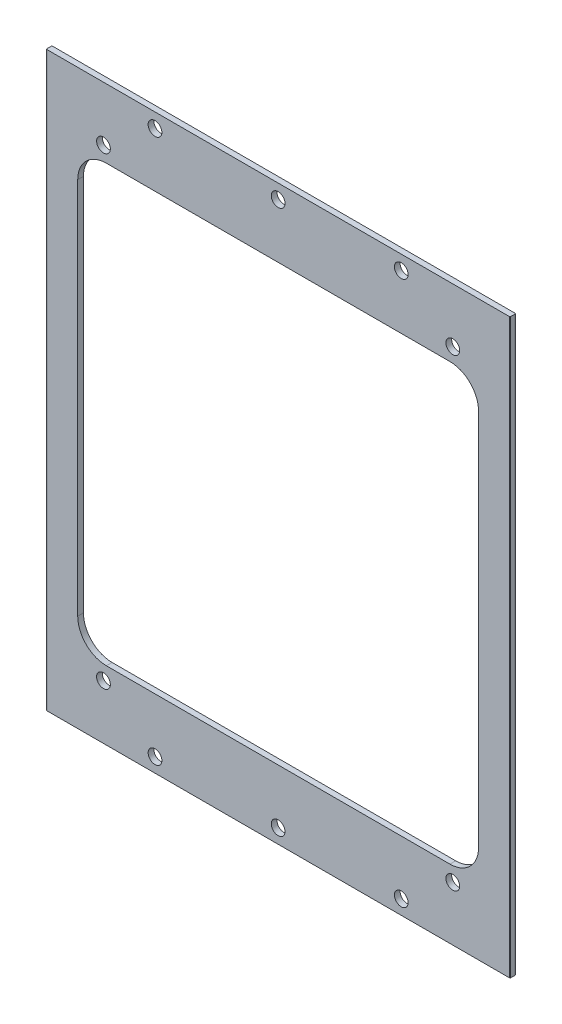
ISO-10303-21;
HEADER;
FILE_DESCRIPTION(('STEP AP214'),'2;1');
FILE_NAME('part.step','',(''),(''),'','','');
FILE_SCHEMA(('AUTOMOTIVE_DESIGN { 1 0 10303 214 1 1 1 1 }'));
ENDSEC;
DATA;
#1=APPLICATION_CONTEXT('core data for automotive mechanical design processes');
#2=APPLICATION_PROTOCOL_DEFINITION('international standard','automotive_design',2000,#1);
#3=PRODUCT_CONTEXT('',#1,'mechanical');
#4=PRODUCT('Part','Part','',(#3));
#5=PRODUCT_RELATED_PRODUCT_CATEGORY('part','',(#4));
#6=PRODUCT_DEFINITION_FORMATION('','',#4);
#7=PRODUCT_DEFINITION_CONTEXT('part definition',#1,'design');
#8=PRODUCT_DEFINITION('design','',#6,#7);
#9=PRODUCT_DEFINITION_SHAPE('','',#8);
#10=(LENGTH_UNIT() NAMED_UNIT(*) SI_UNIT(.MILLI.,.METRE.));
#11=(NAMED_UNIT(*) PLANE_ANGLE_UNIT() SI_UNIT($,.RADIAN.));
#12=(NAMED_UNIT(*) SI_UNIT($,.STERADIAN.) SOLID_ANGLE_UNIT());
#13=UNCERTAINTY_MEASURE_WITH_UNIT(LENGTH_MEASURE(1.E-05),#10,'distance_accuracy_value','');
#14=(GEOMETRIC_REPRESENTATION_CONTEXT(3) GLOBAL_UNCERTAINTY_ASSIGNED_CONTEXT((#13)) GLOBAL_UNIT_ASSIGNED_CONTEXT((#10,
#11,#12)) REPRESENTATION_CONTEXT('',''));
#15=CARTESIAN_POINT('',(0.,0.,0.));
#16=DIRECTION('',(0.,0.,1.));
#17=DIRECTION('',(1.,0.,0.));
#18=AXIS2_PLACEMENT_3D('',#15,#16,#17);
#19=CARTESIAN_POINT('',(40.5,-50.,0.5));
#20=DIRECTION('',(-1.,0.,0.));
#21=DIRECTION('',(0.,0.,1.));
#22=AXIS2_PLACEMENT_3D('',#19,#20,#21);
#23=PLANE('',#22);
#24=DIRECTION('',(0.,0.,-1.));
#25=VECTOR('',#24,1.);
#26=CARTESIAN_POINT('',(40.5,-50.,0.5));
#27=LINE('',#26,#25);
#28=CARTESIAN_POINT('',(40.5,-50.,0.4));
#29=VERTEX_POINT('',#28);
#30=CARTESIAN_POINT('',(40.5,-50.,-0.4));
#31=VERTEX_POINT('',#30);
#32=EDGE_CURVE('E233',#29,#31,#27,.T.);
#33=ORIENTED_EDGE('',*,*,#32,.T.);
#34=DIRECTION('',(0.,1.,0.));
#35=VECTOR('',#34,1.);
#36=CARTESIAN_POINT('',(40.5,50.,-0.4));
#37=LINE('',#36,#35);
#38=CARTESIAN_POINT('',(40.5,50.,-0.4));
#39=VERTEX_POINT('',#38);
#40=EDGE_CURVE('E281',#31,#39,#37,.T.);
#41=ORIENTED_EDGE('',*,*,#40,.T.);
#42=DIRECTION('',(0.,0.,-1.));
#43=VECTOR('',#42,1.);
#44=CARTESIAN_POINT('',(40.5,50.,0.5));
#45=LINE('',#44,#43);
#46=CARTESIAN_POINT('',(40.5,50.,0.4));
#47=VERTEX_POINT('',#46);
#48=EDGE_CURVE('E245',#47,#39,#45,.T.);
#49=ORIENTED_EDGE('',*,*,#48,.F.);
#50=DIRECTION('',(0.,1.,0.));
#51=VECTOR('',#50,1.);
#52=CARTESIAN_POINT('',(40.5,-50.,0.4));
#53=LINE('',#52,#51);
#54=EDGE_CURVE('E248',#47,#29,#53,.F.);
#55=ORIENTED_EDGE('',*,*,#54,.T.);
#56=EDGE_LOOP('',(#33,#41,#49,#55));
#57=FACE_BOUND('',#56,.T.);
#58=ADVANCED_FACE('F32',(#57),#23,.F.);
#59=CARTESIAN_POINT('',(-40.5,50.,0.5));
#60=DIRECTION('',(0.,-1.,0.));
#61=DIRECTION('',(0.,0.,-1.));
#62=AXIS2_PLACEMENT_3D('',#59,#60,#61);
#63=PLANE('',#62);
#64=ORIENTED_EDGE('',*,*,#48,.T.);
#65=CARTESIAN_POINT('',(40.4,50.,-0.4));
#66=DIRECTION('',(0.,-1.,0.));
#67=DIRECTION('',(0.,0.,-1.));
#68=AXIS2_PLACEMENT_3D('',#65,#66,#67);
#69=CIRCLE('',#68,0.1);
#70=CARTESIAN_POINT('',(40.4,50.,-0.5));
#71=VERTEX_POINT('',#70);
#72=EDGE_CURVE('E290',#39,#71,#69,.F.);
#73=ORIENTED_EDGE('',*,*,#72,.T.);
#74=DIRECTION('',(-1.,0.,0.));
#75=VECTOR('',#74,1.);
#76=CARTESIAN_POINT('',(-40.5,50.,-0.5));
#77=LINE('',#76,#75);
#78=CARTESIAN_POINT('',(-40.4,50.,-0.5));
#79=VERTEX_POINT('',#78);
#80=EDGE_CURVE('E214',#71,#79,#77,.T.);
#81=ORIENTED_EDGE('',*,*,#80,.T.);
#82=CARTESIAN_POINT('',(-40.4,50.,-0.4));
#83=DIRECTION('',(0.,-1.,0.));
#84=DIRECTION('',(0.,0.,-1.));
#85=AXIS2_PLACEMENT_3D('',#82,#83,#84);
#86=CIRCLE('',#85,0.1);
#87=CARTESIAN_POINT('',(-40.5,50.,-0.4));
#88=VERTEX_POINT('',#87);
#89=EDGE_CURVE('E286',#79,#88,#86,.F.);
#90=ORIENTED_EDGE('',*,*,#89,.T.);
#91=DIRECTION('',(0.,0.,-1.));
#92=VECTOR('',#91,1.);
#93=CARTESIAN_POINT('',(-40.5,50.,0.5));
#94=LINE('',#93,#92);
#95=CARTESIAN_POINT('',(-40.5,50.,0.4));
#96=VERTEX_POINT('',#95);
#97=EDGE_CURVE('E242',#96,#88,#94,.T.);
#98=ORIENTED_EDGE('',*,*,#97,.F.);
#99=CARTESIAN_POINT('',(-40.4,50.,0.4));
#100=DIRECTION('',(0.,-1.,0.));
#101=DIRECTION('',(0.,0.,-1.));
#102=AXIS2_PLACEMENT_3D('',#99,#100,#101);
#103=CIRCLE('',#102,0.1);
#104=CARTESIAN_POINT('',(-40.4,50.,0.5));
#105=VERTEX_POINT('',#104);
#106=EDGE_CURVE('E284',#96,#105,#103,.F.);
#107=ORIENTED_EDGE('',*,*,#106,.T.);
#108=DIRECTION('',(-1.,0.,0.));
#109=VECTOR('',#108,1.);
#110=CARTESIAN_POINT('',(-40.5,50.,0.5));
#111=LINE('',#110,#109);
#112=CARTESIAN_POINT('',(40.4,50.,0.5));
#113=VERTEX_POINT('',#112);
#114=EDGE_CURVE('E226',#113,#105,#111,.T.);
#115=ORIENTED_EDGE('',*,*,#114,.F.);
#116=CARTESIAN_POINT('',(40.4,50.,0.4));
#117=DIRECTION('',(0.,-1.,0.));
#118=DIRECTION('',(0.,0.,-1.));
#119=AXIS2_PLACEMENT_3D('',#116,#117,#118);
#120=CIRCLE('',#119,0.1);
#121=EDGE_CURVE('E288',#113,#47,#120,.F.);
#122=ORIENTED_EDGE('',*,*,#121,.T.);
#123=EDGE_LOOP('',(#64,#73,#81,#90,#98,#107,#115,#122));
#124=FACE_BOUND('',#123,.T.);
#125=ADVANCED_FACE('F314',(#124),#63,.F.);
#126=CARTESIAN_POINT('',(-40.5,-50.,0.5));
#127=DIRECTION('',(1.,0.,0.));
#128=DIRECTION('',(0.,0.,-1.));
#129=AXIS2_PLACEMENT_3D('',#126,#127,#128);
#130=PLANE('',#129);
#131=ORIENTED_EDGE('',*,*,#97,.T.);
#132=DIRECTION('',(0.,-1.,0.));
#133=VECTOR('',#132,1.);
#134=CARTESIAN_POINT('',(-40.5,-50.,-0.4));
#135=LINE('',#134,#133);
#136=CARTESIAN_POINT('',(-40.5,-50.,-0.4));
#137=VERTEX_POINT('',#136);
#138=EDGE_CURVE('E11',#88,#137,#135,.T.);
#139=ORIENTED_EDGE('',*,*,#138,.T.);
#140=DIRECTION('',(0.,0.,-1.));
#141=VECTOR('',#140,1.);
#142=CARTESIAN_POINT('',(-40.5,-50.,0.5));
#143=LINE('',#142,#141);
#144=CARTESIAN_POINT('',(-40.5,-50.,0.4));
#145=VERTEX_POINT('',#144);
#146=EDGE_CURVE('E240',#145,#137,#143,.T.);
#147=ORIENTED_EDGE('',*,*,#146,.F.);
#148=DIRECTION('',(0.,-1.,0.));
#149=VECTOR('',#148,1.);
#150=CARTESIAN_POINT('',(-40.5,-50.,0.4));
#151=LINE('',#150,#149);
#152=EDGE_CURVE('E40',#145,#96,#151,.F.);
#153=ORIENTED_EDGE('',*,*,#152,.T.);
#154=EDGE_LOOP('',(#131,#139,#147,#153));
#155=FACE_BOUND('',#154,.T.);
#156=ADVANCED_FACE('F310',(#155),#130,.F.);
#157=CARTESIAN_POINT('',(-40.5,-50.,0.5));
#158=DIRECTION('',(0.,1.,0.));
#159=DIRECTION('',(0.,0.,1.));
#160=AXIS2_PLACEMENT_3D('',#157,#158,#159);
#161=PLANE('',#160);
#162=DIRECTION('',(1.,0.,0.));
#163=VECTOR('',#162,1.);
#164=CARTESIAN_POINT('',(-40.5,-50.,-0.5));
#165=LINE('',#164,#163);
#166=CARTESIAN_POINT('',(-40.4,-50.,-0.5));
#167=VERTEX_POINT('',#166);
#168=CARTESIAN_POINT('',(40.4,-50.,-0.5));
#169=VERTEX_POINT('',#168);
#170=EDGE_CURVE('E230',#167,#169,#165,.T.);
#171=ORIENTED_EDGE('',*,*,#170,.T.);
#172=CARTESIAN_POINT('',(40.4,-50.,-0.4));
#173=DIRECTION('',(0.,1.,0.));
#174=DIRECTION('',(0.,0.,1.));
#175=AXIS2_PLACEMENT_3D('',#172,#173,#174);
#176=CIRCLE('',#175,0.1);
#177=EDGE_CURVE('E300',#169,#31,#176,.F.);
#178=ORIENTED_EDGE('',*,*,#177,.T.);
#179=ORIENTED_EDGE('',*,*,#32,.F.);
#180=CARTESIAN_POINT('',(40.4,-50.,0.4));
#181=DIRECTION('',(0.,1.,0.));
#182=DIRECTION('',(0.,0.,1.));
#183=AXIS2_PLACEMENT_3D('',#180,#181,#182);
#184=CIRCLE('',#183,0.1);
#185=CARTESIAN_POINT('',(40.4,-50.,0.5));
#186=VERTEX_POINT('',#185);
#187=EDGE_CURVE('E298',#29,#186,#184,.F.);
#188=ORIENTED_EDGE('',*,*,#187,.T.);
#189=DIRECTION('',(1.,0.,0.));
#190=VECTOR('',#189,1.);
#191=CARTESIAN_POINT('',(-40.5,-50.,0.5));
#192=LINE('',#191,#190);
#193=CARTESIAN_POINT('',(-40.4,-50.,0.5));
#194=VERTEX_POINT('',#193);
#195=EDGE_CURVE('E229',#194,#186,#192,.T.);
#196=ORIENTED_EDGE('',*,*,#195,.F.);
#197=CARTESIAN_POINT('',(-40.4,-50.,0.4));
#198=DIRECTION('',(0.,1.,0.));
#199=DIRECTION('',(0.,0.,1.));
#200=AXIS2_PLACEMENT_3D('',#197,#198,#199);
#201=CIRCLE('',#200,0.1);
#202=EDGE_CURVE('E54',#194,#145,#201,.F.);
#203=ORIENTED_EDGE('',*,*,#202,.T.);
#204=ORIENTED_EDGE('',*,*,#146,.T.);
#205=CARTESIAN_POINT('',(-40.4,-50.,-0.4));
#206=DIRECTION('',(0.,1.,0.));
#207=DIRECTION('',(0.,0.,1.));
#208=AXIS2_PLACEMENT_3D('',#205,#206,#207);
#209=CIRCLE('',#208,0.1);
#210=EDGE_CURVE('E47',#137,#167,#209,.F.);
#211=ORIENTED_EDGE('',*,*,#210,.T.);
#212=EDGE_LOOP('',(#171,#178,#179,#188,#196,#203,#204,#211));
#213=FACE_BOUND('',#212,.T.);
#214=ADVANCED_FACE('F321',(#213),#161,.F.);
#215=CARTESIAN_POINT('',(0.,0.,0.5));
#216=DIRECTION('',(0.,0.,-1.));
#217=DIRECTION('',(-1.,0.,0.));
#218=AXIS2_PLACEMENT_3D('',#215,#216,#217);
#219=PLANE('',#218);
#220=CARTESIAN_POINT('',(0.,47.5,0.5));
#221=DIRECTION('',(0.,0.,1.));
#222=DIRECTION('',(1.,0.,0.));
#223=AXIS2_PLACEMENT_3D('',#220,#221,#222);
#224=CIRCLE('',#223,1.19999999999998);
#225=CARTESIAN_POINT('',(1.19999999999998,47.5,0.5));
#226=VERTEX_POINT('',#225);
#227=EDGE_CURVE('E279',#226,#226,#224,.T.);
#228=ORIENTED_EDGE('',*,*,#227,.F.);
#229=EDGE_LOOP('',(#228));
#230=FACE_BOUND('',#229,.T.);
#231=CARTESIAN_POINT('',(0.,-47.5,0.5));
#232=DIRECTION('',(0.,0.,1.));
#233=DIRECTION('',(1.,0.,0.));
#234=AXIS2_PLACEMENT_3D('',#231,#232,#233);
#235=CIRCLE('',#234,1.19999999999998);
#236=CARTESIAN_POINT('',(1.19999999999998,-47.5,0.5));
#237=VERTEX_POINT('',#236);
#238=EDGE_CURVE('E275',#237,#237,#235,.T.);
#239=ORIENTED_EDGE('',*,*,#238,.F.);
#240=EDGE_LOOP('',(#239));
#241=FACE_BOUND('',#240,.T.);
#242=CARTESIAN_POINT('',(-21.5,47.5,0.5));
#243=DIRECTION('',(0.,0.,1.));
#244=DIRECTION('',(1.,0.,0.));
#245=AXIS2_PLACEMENT_3D('',#242,#243,#244);
#246=CIRCLE('',#245,1.19999999999999);
#247=CARTESIAN_POINT('',(-20.3,47.5,0.5));
#248=VERTEX_POINT('',#247);
#249=EDGE_CURVE('E271',#248,#248,#246,.T.);
#250=ORIENTED_EDGE('',*,*,#249,.F.);
#251=EDGE_LOOP('',(#250));
#252=FACE_BOUND('',#251,.T.);
#253=CARTESIAN_POINT('',(21.5,47.5,0.5));
#254=DIRECTION('',(0.,0.,1.));
#255=DIRECTION('',(1.,0.,0.));
#256=AXIS2_PLACEMENT_3D('',#253,#254,#255);
#257=CIRCLE('',#256,1.19999999999999);
#258=CARTESIAN_POINT('',(22.7,47.5,0.5));
#259=VERTEX_POINT('',#258);
#260=EDGE_CURVE('E267',#259,#259,#257,.T.);
#261=ORIENTED_EDGE('',*,*,#260,.F.);
#262=EDGE_LOOP('',(#261));
#263=FACE_BOUND('',#262,.T.);
#264=CARTESIAN_POINT('',(-21.5,-47.5,0.5));
#265=DIRECTION('',(0.,0.,1.));
#266=DIRECTION('',(1.,0.,0.));
#267=AXIS2_PLACEMENT_3D('',#264,#265,#266);
#268=CIRCLE('',#267,1.19999999999999);
#269=CARTESIAN_POINT('',(-20.3,-47.5,0.5));
#270=VERTEX_POINT('',#269);
#271=EDGE_CURVE('E266',#270,#270,#268,.T.);
#272=ORIENTED_EDGE('',*,*,#271,.F.);
#273=EDGE_LOOP('',(#272));
#274=FACE_BOUND('',#273,.T.);
#275=CARTESIAN_POINT('',(21.5,-47.5,0.5));
#276=DIRECTION('',(0.,0.,1.));
#277=DIRECTION('',(1.,0.,0.));
#278=AXIS2_PLACEMENT_3D('',#275,#276,#277);
#279=CIRCLE('',#278,1.19999999999999);
#280=CARTESIAN_POINT('',(22.7,-47.5,0.5));
#281=VERTEX_POINT('',#280);
#282=EDGE_CURVE('E642',#281,#281,#279,.T.);
#283=ORIENTED_EDGE('',*,*,#282,.F.);
#284=EDGE_LOOP('',(#283));
#285=FACE_BOUND('',#284,.T.);
#286=CARTESIAN_POINT('',(-30.5,40.5,0.5));
#287=DIRECTION('',(0.,0.,1.));
#288=DIRECTION('',(1.,0.,0.));
#289=AXIS2_PLACEMENT_3D('',#286,#287,#288);
#290=CIRCLE('',#289,1.19999999999999);
#291=CARTESIAN_POINT('',(-29.3,40.5,0.5));
#292=VERTEX_POINT('',#291);
#293=EDGE_CURVE('E262',#292,#292,#290,.T.);
#294=ORIENTED_EDGE('',*,*,#293,.F.);
#295=EDGE_LOOP('',(#294));
#296=FACE_BOUND('',#295,.T.);
#297=CARTESIAN_POINT('',(30.5,40.5,0.5));
#298=DIRECTION('',(0.,0.,1.));
#299=DIRECTION('',(1.,0.,0.));
#300=AXIS2_PLACEMENT_3D('',#297,#298,#299);
#301=CIRCLE('',#300,1.19999999999999);
#302=CARTESIAN_POINT('',(31.7,40.5,0.5));
#303=VERTEX_POINT('',#302);
#304=EDGE_CURVE('E258',#303,#303,#301,.T.);
#305=ORIENTED_EDGE('',*,*,#304,.F.);
#306=EDGE_LOOP('',(#305));
#307=FACE_BOUND('',#306,.T.);
#308=CARTESIAN_POINT('',(-30.5,-40.5,0.5));
#309=DIRECTION('',(0.,0.,1.));
#310=DIRECTION('',(1.,0.,0.));
#311=AXIS2_PLACEMENT_3D('',#308,#309,#310);
#312=CIRCLE('',#311,1.19999999999999);
#313=CARTESIAN_POINT('',(-29.3,-40.5,0.5));
#314=VERTEX_POINT('',#313);
#315=EDGE_CURVE('E254',#314,#314,#312,.T.);
#316=ORIENTED_EDGE('',*,*,#315,.F.);
#317=EDGE_LOOP('',(#316));
#318=FACE_BOUND('',#317,.T.);
#319=CARTESIAN_POINT('',(30.5,-40.5,0.5));
#320=DIRECTION('',(0.,0.,1.));
#321=DIRECTION('',(1.,0.,0.));
#322=AXIS2_PLACEMENT_3D('',#319,#320,#321);
#323=CIRCLE('',#322,1.19999999999999);
#324=CARTESIAN_POINT('',(31.7,-40.5,0.5));
#325=VERTEX_POINT('',#324);
#326=EDGE_CURVE('E178',#325,#325,#323,.T.);
#327=ORIENTED_EDGE('',*,*,#326,.F.);
#328=EDGE_LOOP('',(#327));
#329=FACE_BOUND('',#328,.T.);
#330=DIRECTION('',(0.,-1.,0.));
#331=VECTOR('',#330,1.);
#332=CARTESIAN_POINT('',(-35.,-33.,0.5));
#333=LINE('',#332,#331);
#334=CARTESIAN_POINT('',(-35.,33.,0.5));
#335=VERTEX_POINT('',#334);
#336=CARTESIAN_POINT('',(-35.,-33.,0.5));
#337=VERTEX_POINT('',#336);
#338=EDGE_CURVE('E195',#335,#337,#333,.T.);
#339=ORIENTED_EDGE('',*,*,#338,.F.);
#340=CARTESIAN_POINT('',(-30.,33.,0.5));
#341=DIRECTION('',(0.,0.,1.));
#342=DIRECTION('',(-1.,0.,0.));
#343=AXIS2_PLACEMENT_3D('',#340,#341,#342);
#344=CIRCLE('',#343,4.99999999999999);
#345=CARTESIAN_POINT('',(-30.,38.,0.5));
#346=VERTEX_POINT('',#345);
#347=EDGE_CURVE('E153',#346,#335,#344,.T.);
#348=ORIENTED_EDGE('',*,*,#347,.F.);
#349=DIRECTION('',(-1.,0.,0.));
#350=VECTOR('',#349,1.);
#351=CARTESIAN_POINT('',(-30.,38.,0.5));
#352=LINE('',#351,#350);
#353=CARTESIAN_POINT('',(30.,38.,0.5));
#354=VERTEX_POINT('',#353);
#355=EDGE_CURVE('E172',#354,#346,#352,.T.);
#356=ORIENTED_EDGE('',*,*,#355,.F.);
#357=CARTESIAN_POINT('',(30.,33.,0.5));
#358=DIRECTION('',(0.,0.,1.));
#359=DIRECTION('',(-1.,0.,0.));
#360=AXIS2_PLACEMENT_3D('',#357,#358,#359);
#361=CIRCLE('',#360,5.);
#362=CARTESIAN_POINT('',(35.,33.,0.5));
#363=VERTEX_POINT('',#362);
#364=EDGE_CURVE('E175',#363,#354,#361,.T.);
#365=ORIENTED_EDGE('',*,*,#364,.F.);
#366=DIRECTION('',(0.,1.,0.));
#367=VECTOR('',#366,1.);
#368=CARTESIAN_POINT('',(35.,-33.,0.5));
#369=LINE('',#368,#367);
#370=CARTESIAN_POINT('',(35.,-33.,0.5));
#371=VERTEX_POINT('',#370);
#372=EDGE_CURVE('E207',#371,#363,#369,.T.);
#373=ORIENTED_EDGE('',*,*,#372,.F.);
#374=CARTESIAN_POINT('',(30.,-33.,0.5));
#375=DIRECTION('',(0.,0.,1.));
#376=DIRECTION('',(-1.,0.,0.));
#377=AXIS2_PLACEMENT_3D('',#374,#375,#376);
#378=CIRCLE('',#377,5.);
#379=CARTESIAN_POINT('',(30.,-38.,0.5));
#380=VERTEX_POINT('',#379);
#381=EDGE_CURVE('E204',#380,#371,#378,.T.);
#382=ORIENTED_EDGE('',*,*,#381,.F.);
#383=DIRECTION('',(1.,0.,0.));
#384=VECTOR('',#383,1.);
#385=CARTESIAN_POINT('',(-30.,-38.,0.5));
#386=LINE('',#385,#384);
#387=CARTESIAN_POINT('',(-30.,-38.,0.5));
#388=VERTEX_POINT('',#387);
#389=EDGE_CURVE('E201',#388,#380,#386,.T.);
#390=ORIENTED_EDGE('',*,*,#389,.F.);
#391=CARTESIAN_POINT('',(-30.,-33.,0.5));
#392=DIRECTION('',(0.,0.,1.));
#393=DIRECTION('',(-1.,0.,0.));
#394=AXIS2_PLACEMENT_3D('',#391,#392,#393);
#395=CIRCLE('',#394,5.);
#396=EDGE_CURVE('E198',#337,#388,#395,.T.);
#397=ORIENTED_EDGE('',*,*,#396,.F.);
#398=EDGE_LOOP('',(#339,#348,#356,#365,#373,#382,#390,#397));
#399=FACE_BOUND('',#398,.T.);
#400=ORIENTED_EDGE('',*,*,#195,.T.);
#401=DIRECTION('',(0.,1.,0.));
#402=VECTOR('',#401,1.);
#403=CARTESIAN_POINT('',(40.4,0.,0.5));
#404=LINE('',#403,#402);
#405=EDGE_CURVE('E305',#186,#113,#404,.T.);
#406=ORIENTED_EDGE('',*,*,#405,.T.);
#407=ORIENTED_EDGE('',*,*,#114,.T.);
#408=DIRECTION('',(0.,-1.,0.));
#409=VECTOR('',#408,1.);
#410=CARTESIAN_POINT('',(-40.4,0.,0.5));
#411=LINE('',#410,#409);
#412=EDGE_CURVE('E302',#105,#194,#411,.T.);
#413=ORIENTED_EDGE('',*,*,#412,.T.);
#414=EDGE_LOOP('',(#400,#406,#407,#413));
#415=FACE_BOUND('',#414,.T.);
#416=ADVANCED_FACE('F319',(#230,#241,#252,#263,#274,#285,#296,#307,#318,#329,#399,#415),#219,.F.);
#417=CARTESIAN_POINT('',(0.,0.,-0.5));
#418=DIRECTION('',(0.,0.,-1.));
#419=DIRECTION('',(-1.,0.,0.));
#420=AXIS2_PLACEMENT_3D('',#417,#418,#419);
#421=PLANE('',#420);
#422=CARTESIAN_POINT('',(0.,47.5,-0.5));
#423=DIRECTION('',(0.,0.,-1.));
#424=DIRECTION('',(-1.,0.,0.));
#425=AXIS2_PLACEMENT_3D('',#422,#423,#424);
#426=CIRCLE('',#425,1.19999999999996);
#427=CARTESIAN_POINT('',(-1.19999999999996,47.5,-0.5));
#428=VERTEX_POINT('',#427);
#429=EDGE_CURVE('E276',#428,#428,#426,.T.);
#430=ORIENTED_EDGE('',*,*,#429,.F.);
#431=EDGE_LOOP('',(#430));
#432=FACE_BOUND('',#431,.T.);
#433=CARTESIAN_POINT('',(0.,-47.5,-0.5));
#434=DIRECTION('',(0.,0.,-1.));
#435=DIRECTION('',(-1.,0.,0.));
#436=AXIS2_PLACEMENT_3D('',#433,#434,#435);
#437=CIRCLE('',#436,1.19999999999996);
#438=CARTESIAN_POINT('',(-1.19999999999996,-47.5,-0.5));
#439=VERTEX_POINT('',#438);
#440=EDGE_CURVE('E272',#439,#439,#437,.T.);
#441=ORIENTED_EDGE('',*,*,#440,.F.);
#442=EDGE_LOOP('',(#441));
#443=FACE_BOUND('',#442,.T.);
#444=CARTESIAN_POINT('',(-21.5,47.5,-0.5));
#445=DIRECTION('',(0.,0.,-1.));
#446=DIRECTION('',(-1.,0.,0.));
#447=AXIS2_PLACEMENT_3D('',#444,#445,#446);
#448=CIRCLE('',#447,1.19999999999998);
#449=CARTESIAN_POINT('',(-22.7,47.5,-0.5));
#450=VERTEX_POINT('',#449);
#451=EDGE_CURVE('E268',#450,#450,#448,.T.);
#452=ORIENTED_EDGE('',*,*,#451,.F.);
#453=EDGE_LOOP('',(#452));
#454=FACE_BOUND('',#453,.T.);
#455=CARTESIAN_POINT('',(21.5,47.5,-0.5));
#456=DIRECTION('',(0.,0.,-1.));
#457=DIRECTION('',(-1.,0.,0.));
#458=AXIS2_PLACEMENT_3D('',#455,#456,#457);
#459=CIRCLE('',#458,1.19999999999998);
#460=CARTESIAN_POINT('',(20.3,47.5,-0.5));
#461=VERTEX_POINT('',#460);
#462=EDGE_CURVE('E263',#461,#461,#459,.T.);
#463=ORIENTED_EDGE('',*,*,#462,.F.);
#464=EDGE_LOOP('',(#463));
#465=FACE_BOUND('',#464,.T.);
#466=CARTESIAN_POINT('',(-21.5,-47.5,-0.5));
#467=DIRECTION('',(0.,0.,-1.));
#468=DIRECTION('',(-1.,0.,0.));
#469=AXIS2_PLACEMENT_3D('',#466,#467,#468);
#470=CIRCLE('',#469,1.19999999999998);
#471=CARTESIAN_POINT('',(-22.7,-47.5,-0.5));
#472=VERTEX_POINT('',#471);
#473=EDGE_CURVE('E605',#472,#472,#470,.T.);
#474=ORIENTED_EDGE('',*,*,#473,.F.);
#475=EDGE_LOOP('',(#474));
#476=FACE_BOUND('',#475,.T.);
#477=CARTESIAN_POINT('',(21.5,-47.5,-0.5));
#478=DIRECTION('',(0.,0.,-1.));
#479=DIRECTION('',(-1.,0.,0.));
#480=AXIS2_PLACEMENT_3D('',#477,#478,#479);
#481=CIRCLE('',#480,1.19999999999998);
#482=CARTESIAN_POINT('',(20.3,-47.5,-0.5));
#483=VERTEX_POINT('',#482);
#484=EDGE_CURVE('E609',#483,#483,#481,.T.);
#485=ORIENTED_EDGE('',*,*,#484,.F.);
#486=EDGE_LOOP('',(#485));
#487=FACE_BOUND('',#486,.T.);
#488=CARTESIAN_POINT('',(-30.5,40.5,-0.5));
#489=DIRECTION('',(0.,0.,-1.));
#490=DIRECTION('',(-1.,0.,0.));
#491=AXIS2_PLACEMENT_3D('',#488,#489,#490);
#492=CIRCLE('',#491,1.19999999999998);
#493=CARTESIAN_POINT('',(-31.7,40.5,-0.5));
#494=VERTEX_POINT('',#493);
#495=EDGE_CURVE('E259',#494,#494,#492,.T.);
#496=ORIENTED_EDGE('',*,*,#495,.F.);
#497=EDGE_LOOP('',(#496));
#498=FACE_BOUND('',#497,.T.);
#499=CARTESIAN_POINT('',(30.5,40.5,-0.5));
#500=DIRECTION('',(0.,0.,-1.));
#501=DIRECTION('',(-1.,0.,0.));
#502=AXIS2_PLACEMENT_3D('',#499,#500,#501);
#503=CIRCLE('',#502,1.19999999999998);
#504=CARTESIAN_POINT('',(29.3,40.5,-0.5));
#505=VERTEX_POINT('',#504);
#506=EDGE_CURVE('E255',#505,#505,#503,.T.);
#507=ORIENTED_EDGE('',*,*,#506,.F.);
#508=EDGE_LOOP('',(#507));
#509=FACE_BOUND('',#508,.T.);
#510=CARTESIAN_POINT('',(-30.5,-40.5,-0.5));
#511=DIRECTION('',(0.,0.,-1.));
#512=DIRECTION('',(-1.,0.,0.));
#513=AXIS2_PLACEMENT_3D('',#510,#511,#512);
#514=CIRCLE('',#513,1.19999999999998);
#515=CARTESIAN_POINT('',(-31.7,-40.5,-0.5));
#516=VERTEX_POINT('',#515);
#517=EDGE_CURVE('E251',#516,#516,#514,.T.);
#518=ORIENTED_EDGE('',*,*,#517,.F.);
#519=EDGE_LOOP('',(#518));
#520=FACE_BOUND('',#519,.T.);
#521=CARTESIAN_POINT('',(30.5,-40.5,-0.5));
#522=DIRECTION('',(0.,0.,-1.));
#523=DIRECTION('',(-1.,0.,0.));
#524=AXIS2_PLACEMENT_3D('',#521,#522,#523);
#525=CIRCLE('',#524,1.19999999999998);
#526=CARTESIAN_POINT('',(29.3,-40.5,-0.5));
#527=VERTEX_POINT('',#526);
#528=EDGE_CURVE('E196',#527,#527,#525,.T.);
#529=ORIENTED_EDGE('',*,*,#528,.F.);
#530=EDGE_LOOP('',(#529));
#531=FACE_BOUND('',#530,.T.);
#532=CARTESIAN_POINT('',(-30.,33.,-0.5));
#533=DIRECTION('',(0.,0.,1.));
#534=DIRECTION('',(-1.,0.,0.));
#535=AXIS2_PLACEMENT_3D('',#532,#533,#534);
#536=CIRCLE('',#535,4.99999999999999);
#537=CARTESIAN_POINT('',(-30.,38.,-0.5));
#538=VERTEX_POINT('',#537);
#539=CARTESIAN_POINT('',(-35.,33.,-0.5));
#540=VERTEX_POINT('',#539);
#541=EDGE_CURVE('E150',#538,#540,#536,.T.);
#542=ORIENTED_EDGE('',*,*,#541,.T.);
#543=DIRECTION('',(0.,-1.,0.));
#544=VECTOR('',#543,1.);
#545=CARTESIAN_POINT('',(-35.,-33.,-0.5));
#546=LINE('',#545,#544);
#547=CARTESIAN_POINT('',(-35.,-33.,-0.5));
#548=VERTEX_POINT('',#547);
#549=EDGE_CURVE('E162',#540,#548,#546,.T.);
#550=ORIENTED_EDGE('',*,*,#549,.T.);
#551=CARTESIAN_POINT('',(-30.,-33.,-0.5));
#552=DIRECTION('',(0.,0.,1.));
#553=DIRECTION('',(-1.,0.,0.));
#554=AXIS2_PLACEMENT_3D('',#551,#552,#553);
#555=CIRCLE('',#554,5.);
#556=CARTESIAN_POINT('',(-30.,-38.,-0.5));
#557=VERTEX_POINT('',#556);
#558=EDGE_CURVE('E166',#548,#557,#555,.T.);
#559=ORIENTED_EDGE('',*,*,#558,.T.);
#560=DIRECTION('',(1.,0.,0.));
#561=VECTOR('',#560,1.);
#562=CARTESIAN_POINT('',(-30.,-38.,-0.5));
#563=LINE('',#562,#561);
#564=CARTESIAN_POINT('',(30.,-38.,-0.5));
#565=VERTEX_POINT('',#564);
#566=EDGE_CURVE('E182',#557,#565,#563,.T.);
#567=ORIENTED_EDGE('',*,*,#566,.T.);
#568=CARTESIAN_POINT('',(30.,-33.,-0.5));
#569=DIRECTION('',(0.,0.,1.));
#570=DIRECTION('',(-1.,0.,0.));
#571=AXIS2_PLACEMENT_3D('',#568,#569,#570);
#572=CIRCLE('',#571,5.);
#573=CARTESIAN_POINT('',(35.,-33.,-0.5));
#574=VERTEX_POINT('',#573);
#575=EDGE_CURVE('E185',#565,#574,#572,.T.);
#576=ORIENTED_EDGE('',*,*,#575,.T.);
#577=DIRECTION('',(0.,1.,0.));
#578=VECTOR('',#577,1.);
#579=CARTESIAN_POINT('',(35.,-33.,-0.5));
#580=LINE('',#579,#578);
#581=CARTESIAN_POINT('',(35.,33.,-0.5));
#582=VERTEX_POINT('',#581);
#583=EDGE_CURVE('E188',#574,#582,#580,.T.);
#584=ORIENTED_EDGE('',*,*,#583,.T.);
#585=CARTESIAN_POINT('',(30.,33.,-0.5));
#586=DIRECTION('',(0.,0.,1.));
#587=DIRECTION('',(-1.,0.,0.));
#588=AXIS2_PLACEMENT_3D('',#585,#586,#587);
#589=CIRCLE('',#588,5.);
#590=CARTESIAN_POINT('',(30.,38.,-0.5));
#591=VERTEX_POINT('',#590);
#592=EDGE_CURVE('E191',#582,#591,#589,.T.);
#593=ORIENTED_EDGE('',*,*,#592,.T.);
#594=DIRECTION('',(-1.,0.,0.));
#595=VECTOR('',#594,1.);
#596=CARTESIAN_POINT('',(-30.,38.,-0.5));
#597=LINE('',#596,#595);
#598=EDGE_CURVE('E158',#591,#538,#597,.T.);
#599=ORIENTED_EDGE('',*,*,#598,.T.);
#600=EDGE_LOOP('',(#542,#550,#559,#567,#576,#584,#593,#599));
#601=FACE_BOUND('',#600,.T.);
#602=ORIENTED_EDGE('',*,*,#80,.F.);
#603=DIRECTION('',(0.,1.,0.));
#604=VECTOR('',#603,1.);
#605=CARTESIAN_POINT('',(40.4,-50.,-0.5));
#606=LINE('',#605,#604);
#607=EDGE_CURVE('E294',#71,#169,#606,.F.);
#608=ORIENTED_EDGE('',*,*,#607,.T.);
#609=ORIENTED_EDGE('',*,*,#170,.F.);
#610=DIRECTION('',(0.,-1.,0.));
#611=VECTOR('',#610,1.);
#612=CARTESIAN_POINT('',(-40.4,50.,-0.5));
#613=LINE('',#612,#611);
#614=EDGE_CURVE('E292',#167,#79,#613,.F.);
#615=ORIENTED_EDGE('',*,*,#614,.T.);
#616=EDGE_LOOP('',(#602,#608,#609,#615));
#617=FACE_BOUND('',#616,.T.);
#618=ADVANCED_FACE('F168',(#432,#443,#454,#465,#476,#487,#498,#509,#520,#531,#601,#617),#421,.T.);
#619=CARTESIAN_POINT('',(-30.,33.,-0.5));
#620=DIRECTION('',(0.,0.,1.));
#621=DIRECTION('',(1.,0.,0.));
#622=AXIS2_PLACEMENT_3D('',#619,#620,#621);
#623=CYLINDRICAL_SURFACE('',#622,4.99999999999999);
#624=ORIENTED_EDGE('',*,*,#347,.T.);
#625=DIRECTION('',(0.,0.,1.));
#626=VECTOR('',#625,1.);
#627=CARTESIAN_POINT('',(-35.,33.,-0.5));
#628=LINE('',#627,#626);
#629=EDGE_CURVE('E146',#540,#335,#628,.T.);
#630=ORIENTED_EDGE('',*,*,#629,.F.);
#631=ORIENTED_EDGE('',*,*,#541,.F.);
#632=DIRECTION('',(0.,0.,1.));
#633=VECTOR('',#632,1.);
#634=CARTESIAN_POINT('',(-30.,38.,-0.5));
#635=LINE('',#634,#633);
#636=EDGE_CURVE('E212',#538,#346,#635,.T.);
#637=ORIENTED_EDGE('',*,*,#636,.T.);
#638=EDGE_LOOP('',(#624,#630,#631,#637));
#639=FACE_BOUND('',#638,.T.);
#640=ADVANCED_FACE('F148',(#639),#623,.F.);
#641=CARTESIAN_POINT('',(-30.,38.,-0.5));
#642=DIRECTION('',(0.,1.,0.));
#643=DIRECTION('',(0.,0.,1.));
#644=AXIS2_PLACEMENT_3D('',#641,#642,#643);
#645=PLANE('',#644);
#646=ORIENTED_EDGE('',*,*,#355,.T.);
#647=ORIENTED_EDGE('',*,*,#636,.F.);
#648=ORIENTED_EDGE('',*,*,#598,.F.);
#649=DIRECTION('',(0.,0.,1.));
#650=VECTOR('',#649,1.);
#651=CARTESIAN_POINT('',(30.,38.,-0.5));
#652=LINE('',#651,#650);
#653=EDGE_CURVE('E215',#591,#354,#652,.T.);
#654=ORIENTED_EDGE('',*,*,#653,.T.);
#655=EDGE_LOOP('',(#646,#647,#648,#654));
#656=FACE_BOUND('',#655,.T.);
#657=ADVANCED_FACE('F398',(#656),#645,.F.);
#658=CARTESIAN_POINT('',(30.,33.,-0.5));
#659=DIRECTION('',(0.,0.,1.));
#660=DIRECTION('',(1.,0.,0.));
#661=AXIS2_PLACEMENT_3D('',#658,#659,#660);
#662=CYLINDRICAL_SURFACE('',#661,5.);
#663=ORIENTED_EDGE('',*,*,#364,.T.);
#664=ORIENTED_EDGE('',*,*,#653,.F.);
#665=ORIENTED_EDGE('',*,*,#592,.F.);
#666=DIRECTION('',(0.,0.,1.));
#667=VECTOR('',#666,1.);
#668=CARTESIAN_POINT('',(35.,33.,-0.5));
#669=LINE('',#668,#667);
#670=EDGE_CURVE('E217',#582,#363,#669,.T.);
#671=ORIENTED_EDGE('',*,*,#670,.T.);
#672=EDGE_LOOP('',(#663,#664,#665,#671));
#673=FACE_BOUND('',#672,.T.);
#674=ADVANCED_FACE('F401',(#673),#662,.F.);
#675=CARTESIAN_POINT('',(35.,-33.,-0.5));
#676=DIRECTION('',(1.,0.,0.));
#677=DIRECTION('',(0.,0.,-1.));
#678=AXIS2_PLACEMENT_3D('',#675,#676,#677);
#679=PLANE('',#678);
#680=ORIENTED_EDGE('',*,*,#372,.T.);
#681=ORIENTED_EDGE('',*,*,#670,.F.);
#682=ORIENTED_EDGE('',*,*,#583,.F.);
#683=DIRECTION('',(0.,0.,1.));
#684=VECTOR('',#683,1.);
#685=CARTESIAN_POINT('',(35.,-33.,-0.5));
#686=LINE('',#685,#684);
#687=EDGE_CURVE('E219',#574,#371,#686,.T.);
#688=ORIENTED_EDGE('',*,*,#687,.T.);
#689=EDGE_LOOP('',(#680,#681,#682,#688));
#690=FACE_BOUND('',#689,.T.);
#691=ADVANCED_FACE('F405',(#690),#679,.F.);
#692=CARTESIAN_POINT('',(30.,-33.,-0.5));
#693=DIRECTION('',(0.,0.,1.));
#694=DIRECTION('',(1.,0.,0.));
#695=AXIS2_PLACEMENT_3D('',#692,#693,#694);
#696=CYLINDRICAL_SURFACE('',#695,5.);
#697=ORIENTED_EDGE('',*,*,#381,.T.);
#698=ORIENTED_EDGE('',*,*,#687,.F.);
#699=ORIENTED_EDGE('',*,*,#575,.F.);
#700=DIRECTION('',(0.,0.,1.));
#701=VECTOR('',#700,1.);
#702=CARTESIAN_POINT('',(30.,-38.,-0.5));
#703=LINE('',#702,#701);
#704=EDGE_CURVE('E221',#565,#380,#703,.T.);
#705=ORIENTED_EDGE('',*,*,#704,.T.);
#706=EDGE_LOOP('',(#697,#698,#699,#705));
#707=FACE_BOUND('',#706,.T.);
#708=ADVANCED_FACE('F409',(#707),#696,.F.);
#709=CARTESIAN_POINT('',(-30.,-38.,-0.5));
#710=DIRECTION('',(0.,-1.,0.));
#711=DIRECTION('',(0.,0.,-1.));
#712=AXIS2_PLACEMENT_3D('',#709,#710,#711);
#713=PLANE('',#712);
#714=ORIENTED_EDGE('',*,*,#389,.T.);
#715=ORIENTED_EDGE('',*,*,#704,.F.);
#716=ORIENTED_EDGE('',*,*,#566,.F.);
#717=DIRECTION('',(0.,0.,1.));
#718=VECTOR('',#717,1.);
#719=CARTESIAN_POINT('',(-30.,-38.,-0.5));
#720=LINE('',#719,#718);
#721=EDGE_CURVE('E223',#557,#388,#720,.T.);
#722=ORIENTED_EDGE('',*,*,#721,.T.);
#723=EDGE_LOOP('',(#714,#715,#716,#722));
#724=FACE_BOUND('',#723,.T.);
#725=ADVANCED_FACE('F413',(#724),#713,.F.);
#726=CARTESIAN_POINT('',(-30.,-33.,-0.5));
#727=DIRECTION('',(0.,0.,1.));
#728=DIRECTION('',(1.,0.,0.));
#729=AXIS2_PLACEMENT_3D('',#726,#727,#728);
#730=CYLINDRICAL_SURFACE('',#729,5.);
#731=ORIENTED_EDGE('',*,*,#396,.T.);
#732=ORIENTED_EDGE('',*,*,#721,.F.);
#733=ORIENTED_EDGE('',*,*,#558,.F.);
#734=DIRECTION('',(0.,0.,1.));
#735=VECTOR('',#734,1.);
#736=CARTESIAN_POINT('',(-35.,-33.,-0.5));
#737=LINE('',#736,#735);
#738=EDGE_CURVE('E157',#548,#337,#737,.T.);
#739=ORIENTED_EDGE('',*,*,#738,.T.);
#740=EDGE_LOOP('',(#731,#732,#733,#739));
#741=FACE_BOUND('',#740,.T.);
#742=ADVANCED_FACE('F417',(#741),#730,.F.);
#743=CARTESIAN_POINT('',(-35.,-33.,-0.5));
#744=DIRECTION('',(-1.,0.,0.));
#745=DIRECTION('',(0.,-1.,0.));
#746=AXIS2_PLACEMENT_3D('',#743,#744,#745);
#747=PLANE('',#746);
#748=ORIENTED_EDGE('',*,*,#338,.T.);
#749=ORIENTED_EDGE('',*,*,#738,.F.);
#750=ORIENTED_EDGE('',*,*,#549,.F.);
#751=ORIENTED_EDGE('',*,*,#629,.T.);
#752=EDGE_LOOP('',(#748,#749,#750,#751));
#753=FACE_BOUND('',#752,.T.);
#754=ADVANCED_FACE('F163',(#753),#747,.F.);
#755=CARTESIAN_POINT('',(30.5,-40.5,0.5));
#756=DIRECTION('',(0.,0.,1.));
#757=DIRECTION('',(1.,0.,0.));
#758=AXIS2_PLACEMENT_3D('',#755,#756,#757);
#759=CYLINDRICAL_SURFACE('',#758,1.19999999999998);
#760=ORIENTED_EDGE('',*,*,#528,.T.);
#761=EDGE_LOOP('',(#760));
#762=FACE_BOUND('',#761,.T.);
#763=ORIENTED_EDGE('',*,*,#326,.T.);
#764=EDGE_LOOP('',(#763));
#765=FACE_BOUND('',#764,.T.);
#766=ADVANCED_FACE('F393',(#762,#765),#759,.F.);
#767=CARTESIAN_POINT('',(-30.5,-40.5,0.5));
#768=DIRECTION('',(0.,0.,1.));
#769=DIRECTION('',(1.,0.,0.));
#770=AXIS2_PLACEMENT_3D('',#767,#768,#769);
#771=CYLINDRICAL_SURFACE('',#770,1.19999999999998);
#772=ORIENTED_EDGE('',*,*,#517,.T.);
#773=EDGE_LOOP('',(#772));
#774=FACE_BOUND('',#773,.T.);
#775=ORIENTED_EDGE('',*,*,#315,.T.);
#776=EDGE_LOOP('',(#775));
#777=FACE_BOUND('',#776,.T.);
#778=ADVANCED_FACE('F389',(#774,#777),#771,.F.);
#779=CARTESIAN_POINT('',(30.5,40.5,0.5));
#780=DIRECTION('',(0.,0.,1.));
#781=DIRECTION('',(1.,0.,0.));
#782=AXIS2_PLACEMENT_3D('',#779,#780,#781);
#783=CYLINDRICAL_SURFACE('',#782,1.19999999999998);
#784=ORIENTED_EDGE('',*,*,#506,.T.);
#785=EDGE_LOOP('',(#784));
#786=FACE_BOUND('',#785,.T.);
#787=ORIENTED_EDGE('',*,*,#304,.T.);
#788=EDGE_LOOP('',(#787));
#789=FACE_BOUND('',#788,.T.);
#790=ADVANCED_FACE('F385',(#786,#789),#783,.F.);
#791=CARTESIAN_POINT('',(-30.5,40.5,0.5));
#792=DIRECTION('',(0.,0.,1.));
#793=DIRECTION('',(1.,0.,0.));
#794=AXIS2_PLACEMENT_3D('',#791,#792,#793);
#795=CYLINDRICAL_SURFACE('',#794,1.19999999999998);
#796=ORIENTED_EDGE('',*,*,#495,.T.);
#797=EDGE_LOOP('',(#796));
#798=FACE_BOUND('',#797,.T.);
#799=ORIENTED_EDGE('',*,*,#293,.T.);
#800=EDGE_LOOP('',(#799));
#801=FACE_BOUND('',#800,.T.);
#802=ADVANCED_FACE('F381',(#798,#801),#795,.F.);
#803=CARTESIAN_POINT('',(21.5,-47.5,0.5));
#804=DIRECTION('',(0.,0.,1.));
#805=DIRECTION('',(1.,0.,0.));
#806=AXIS2_PLACEMENT_3D('',#803,#804,#805);
#807=CYLINDRICAL_SURFACE('',#806,1.19999999999998);
#808=ORIENTED_EDGE('',*,*,#484,.T.);
#809=EDGE_LOOP('',(#808));
#810=FACE_BOUND('',#809,.T.);
#811=ORIENTED_EDGE('',*,*,#282,.T.);
#812=EDGE_LOOP('',(#811));
#813=FACE_BOUND('',#812,.T.);
#814=ADVANCED_FACE('F377',(#810,#813),#807,.F.);
#815=CARTESIAN_POINT('',(-21.5,-47.5,0.5));
#816=DIRECTION('',(0.,0.,1.));
#817=DIRECTION('',(1.,0.,0.));
#818=AXIS2_PLACEMENT_3D('',#815,#816,#817);
#819=CYLINDRICAL_SURFACE('',#818,1.19999999999998);
#820=ORIENTED_EDGE('',*,*,#473,.T.);
#821=EDGE_LOOP('',(#820));
#822=FACE_BOUND('',#821,.T.);
#823=ORIENTED_EDGE('',*,*,#271,.T.);
#824=EDGE_LOOP('',(#823));
#825=FACE_BOUND('',#824,.T.);
#826=ADVANCED_FACE('F373',(#822,#825),#819,.F.);
#827=CARTESIAN_POINT('',(21.5,47.5,0.5));
#828=DIRECTION('',(0.,0.,1.));
#829=DIRECTION('',(1.,0.,0.));
#830=AXIS2_PLACEMENT_3D('',#827,#828,#829);
#831=CYLINDRICAL_SURFACE('',#830,1.19999999999998);
#832=ORIENTED_EDGE('',*,*,#462,.T.);
#833=EDGE_LOOP('',(#832));
#834=FACE_BOUND('',#833,.T.);
#835=ORIENTED_EDGE('',*,*,#260,.T.);
#836=EDGE_LOOP('',(#835));
#837=FACE_BOUND('',#836,.T.);
#838=ADVANCED_FACE('F369',(#834,#837),#831,.F.);
#839=CARTESIAN_POINT('',(-21.5,47.5,0.5));
#840=DIRECTION('',(0.,0.,1.));
#841=DIRECTION('',(1.,0.,0.));
#842=AXIS2_PLACEMENT_3D('',#839,#840,#841);
#843=CYLINDRICAL_SURFACE('',#842,1.19999999999998);
#844=ORIENTED_EDGE('',*,*,#451,.T.);
#845=EDGE_LOOP('',(#844));
#846=FACE_BOUND('',#845,.T.);
#847=ORIENTED_EDGE('',*,*,#249,.T.);
#848=EDGE_LOOP('',(#847));
#849=FACE_BOUND('',#848,.T.);
#850=ADVANCED_FACE('F362',(#846,#849),#843,.F.);
#851=CARTESIAN_POINT('',(0.,-47.5,0.5));
#852=DIRECTION('',(0.,0.,1.));
#853=DIRECTION('',(1.,0.,0.));
#854=AXIS2_PLACEMENT_3D('',#851,#852,#853);
#855=CYLINDRICAL_SURFACE('',#854,1.19999999999996);
#856=ORIENTED_EDGE('',*,*,#440,.T.);
#857=EDGE_LOOP('',(#856));
#858=FACE_BOUND('',#857,.T.);
#859=ORIENTED_EDGE('',*,*,#238,.T.);
#860=EDGE_LOOP('',(#859));
#861=FACE_BOUND('',#860,.T.);
#862=ADVANCED_FACE('F356',(#858,#861),#855,.F.);
#863=CARTESIAN_POINT('',(0.,47.5,0.5));
#864=DIRECTION('',(0.,0.,1.));
#865=DIRECTION('',(1.,0.,0.));
#866=AXIS2_PLACEMENT_3D('',#863,#864,#865);
#867=CYLINDRICAL_SURFACE('',#866,1.19999999999996);
#868=ORIENTED_EDGE('',*,*,#429,.T.);
#869=EDGE_LOOP('',(#868));
#870=FACE_BOUND('',#869,.T.);
#871=ORIENTED_EDGE('',*,*,#227,.T.);
#872=EDGE_LOOP('',(#871));
#873=FACE_BOUND('',#872,.T.);
#874=ADVANCED_FACE('F352',(#870,#873),#867,.F.);
#875=CARTESIAN_POINT('',(40.4,-50.,-0.4));
#876=DIRECTION('',(0.,-1.,0.));
#877=DIRECTION('',(0.,0.,-1.));
#878=AXIS2_PLACEMENT_3D('',#875,#876,#877);
#879=CYLINDRICAL_SURFACE('',#878,0.1);
#880=ORIENTED_EDGE('',*,*,#177,.F.);
#881=ORIENTED_EDGE('',*,*,#607,.F.);
#882=ORIENTED_EDGE('',*,*,#72,.F.);
#883=ORIENTED_EDGE('',*,*,#40,.F.);
#884=EDGE_LOOP('',(#880,#881,#882,#883));
#885=FACE_BOUND('',#884,.T.);
#886=ADVANCED_FACE('F332',(#885),#879,.T.);
#887=CARTESIAN_POINT('',(40.4,0.,0.4));
#888=DIRECTION('',(0.,1.,0.));
#889=DIRECTION('',(0.,0.,1.));
#890=AXIS2_PLACEMENT_3D('',#887,#888,#889);
#891=CYLINDRICAL_SURFACE('',#890,0.1);
#892=ORIENTED_EDGE('',*,*,#187,.F.);
#893=ORIENTED_EDGE('',*,*,#54,.F.);
#894=ORIENTED_EDGE('',*,*,#121,.F.);
#895=ORIENTED_EDGE('',*,*,#405,.F.);
#896=EDGE_LOOP('',(#892,#893,#894,#895));
#897=FACE_BOUND('',#896,.T.);
#898=ADVANCED_FACE('F326',(#897),#891,.T.);
#899=CARTESIAN_POINT('',(-40.4,-50.,-0.4));
#900=DIRECTION('',(0.,1.,0.));
#901=DIRECTION('',(0.,0.,1.));
#902=AXIS2_PLACEMENT_3D('',#899,#900,#901);
#903=CYLINDRICAL_SURFACE('',#902,0.1);
#904=ORIENTED_EDGE('',*,*,#89,.F.);
#905=ORIENTED_EDGE('',*,*,#614,.F.);
#906=ORIENTED_EDGE('',*,*,#210,.F.);
#907=ORIENTED_EDGE('',*,*,#138,.F.);
#908=EDGE_LOOP('',(#904,#905,#906,#907));
#909=FACE_BOUND('',#908,.T.);
#910=ADVANCED_FACE('F336',(#909),#903,.T.);
#911=CARTESIAN_POINT('',(-40.4,0.,0.4));
#912=DIRECTION('',(0.,-1.,0.));
#913=DIRECTION('',(0.,0.,-1.));
#914=AXIS2_PLACEMENT_3D('',#911,#912,#913);
#915=CYLINDRICAL_SURFACE('',#914,0.1);
#916=ORIENTED_EDGE('',*,*,#106,.F.);
#917=ORIENTED_EDGE('',*,*,#152,.F.);
#918=ORIENTED_EDGE('',*,*,#202,.F.);
#919=ORIENTED_EDGE('',*,*,#412,.F.);
#920=EDGE_LOOP('',(#916,#917,#918,#919));
#921=FACE_BOUND('',#920,.T.);
#922=ADVANCED_FACE('F34',(#921),#915,.T.);
#923=CLOSED_SHELL('',(#58,#125,#156,#214,#416,#618,#640,#657,#674,#691,#708,#725,#742,#754,#766,
#778,#790,#802,#814,#826,#838,#850,#862,#874,#886,#898,#910,#922));
#924=MANIFOLD_SOLID_BREP('B2',#923);
#925=ADVANCED_BREP_SHAPE_REPRESENTATION('',(#18,#924),#14);
#926=SHAPE_DEFINITION_REPRESENTATION(#9,#925);
ENDSEC;
END-ISO-10303-21;
